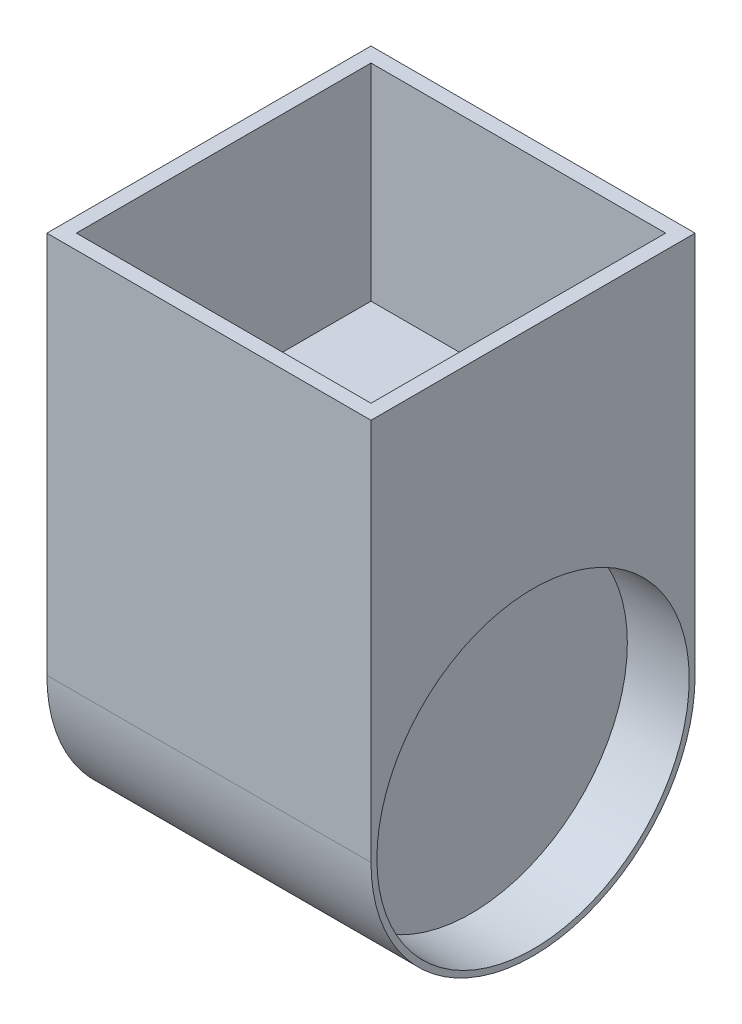
ISO-10303-21;
HEADER;
FILE_DESCRIPTION(('STEP AP214'),'2;1');
FILE_NAME('part.step','',(''),(''),'','','');
FILE_SCHEMA(('AUTOMOTIVE_DESIGN { 1 0 10303 214 1 1 1 1 }'));
ENDSEC;
DATA;
#1=APPLICATION_CONTEXT('core data for automotive mechanical design processes');
#2=APPLICATION_PROTOCOL_DEFINITION('international standard','automotive_design',2000,#1);
#3=PRODUCT_CONTEXT('',#1,'mechanical');
#4=PRODUCT('Part','Part','',(#3));
#5=PRODUCT_RELATED_PRODUCT_CATEGORY('part','',(#4));
#6=PRODUCT_DEFINITION_FORMATION('','',#4);
#7=PRODUCT_DEFINITION_CONTEXT('part definition',#1,'design');
#8=PRODUCT_DEFINITION('design','',#6,#7);
#9=PRODUCT_DEFINITION_SHAPE('','',#8);
#10=(LENGTH_UNIT() NAMED_UNIT(*) SI_UNIT(.MILLI.,.METRE.));
#11=(NAMED_UNIT(*) PLANE_ANGLE_UNIT() SI_UNIT($,.RADIAN.));
#12=(NAMED_UNIT(*) SI_UNIT($,.STERADIAN.) SOLID_ANGLE_UNIT());
#13=UNCERTAINTY_MEASURE_WITH_UNIT(LENGTH_MEASURE(1.E-05),#10,'distance_accuracy_value','');
#14=(GEOMETRIC_REPRESENTATION_CONTEXT(3) GLOBAL_UNCERTAINTY_ASSIGNED_CONTEXT((#13)) GLOBAL_UNIT_ASSIGNED_CONTEXT((#10,
#11,#12)) REPRESENTATION_CONTEXT('',''));
#15=CARTESIAN_POINT('',(0.,0.,0.));
#16=DIRECTION('',(0.,0.,1.));
#17=DIRECTION('',(1.,0.,0.));
#18=AXIS2_PLACEMENT_3D('',#15,#16,#17);
#19=CARTESIAN_POINT('',(110.,129.977668721997,55.));
#20=DIRECTION('',(0.,1.,0.));
#21=DIRECTION('',(0.,0.,1.));
#22=AXIS2_PLACEMENT_3D('',#19,#20,#21);
#23=PLANE('',#22);
#24=DIRECTION('',(0.,0.,1.));
#25=VECTOR('',#24,1.);
#26=CARTESIAN_POINT('',(4.99999999999999,129.977668721997,50.));
#27=LINE('',#26,#25);
#28=CARTESIAN_POINT('',(4.99999999999999,129.977668721997,-50.));
#29=VERTEX_POINT('',#28);
#30=CARTESIAN_POINT('',(4.99999999999999,129.977668721997,50.));
#31=VERTEX_POINT('',#30);
#32=EDGE_CURVE('E53',#29,#31,#27,.T.);
#33=ORIENTED_EDGE('',*,*,#32,.F.);
#34=DIRECTION('',(-1.,0.,0.));
#35=VECTOR('',#34,1.);
#36=CARTESIAN_POINT('',(4.99999999999999,129.977668721997,-50.));
#37=LINE('',#36,#35);
#38=CARTESIAN_POINT('',(105.,129.977668721997,-50.));
#39=VERTEX_POINT('',#38);
#40=EDGE_CURVE('E129',#39,#29,#37,.T.);
#41=ORIENTED_EDGE('',*,*,#40,.F.);
#42=DIRECTION('',(0.,0.,-1.));
#43=VECTOR('',#42,1.);
#44=CARTESIAN_POINT('',(105.,129.977668721997,-50.));
#45=LINE('',#44,#43);
#46=CARTESIAN_POINT('',(105.,129.977668721997,50.));
#47=VERTEX_POINT('',#46);
#48=EDGE_CURVE('E132',#47,#39,#45,.T.);
#49=ORIENTED_EDGE('',*,*,#48,.F.);
#50=DIRECTION('',(1.,0.,0.));
#51=VECTOR('',#50,1.);
#52=CARTESIAN_POINT('',(105.,129.977668721997,50.));
#53=LINE('',#52,#51);
#54=EDGE_CURVE('E141',#31,#47,#53,.T.);
#55=ORIENTED_EDGE('',*,*,#54,.F.);
#56=EDGE_LOOP('',(#33,#41,#49,#55));
#57=FACE_BOUND('',#56,.T.);
#58=DIRECTION('',(0.,0.,-1.));
#59=VECTOR('',#58,1.);
#60=CARTESIAN_POINT('',(0.,129.977668721997,55.));
#61=LINE('',#60,#59);
#62=CARTESIAN_POINT('',(0.,129.977668721997,55.));
#63=VERTEX_POINT('',#62);
#64=CARTESIAN_POINT('',(0.,129.977668721997,-55.));
#65=VERTEX_POINT('',#64);
#66=EDGE_CURVE('E148',#63,#65,#61,.T.);
#67=ORIENTED_EDGE('',*,*,#66,.F.);
#68=DIRECTION('',(-1.,0.,0.));
#69=VECTOR('',#68,1.);
#70=CARTESIAN_POINT('',(110.,129.977668721997,55.));
#71=LINE('',#70,#69);
#72=CARTESIAN_POINT('',(110.,129.977668721997,55.));
#73=VERTEX_POINT('',#72);
#74=EDGE_CURVE('E11',#73,#63,#71,.T.);
#75=ORIENTED_EDGE('',*,*,#74,.F.);
#76=DIRECTION('',(0.,0.,-1.));
#77=VECTOR('',#76,1.);
#78=CARTESIAN_POINT('',(110.,129.977668721997,55.));
#79=LINE('',#78,#77);
#80=CARTESIAN_POINT('',(110.,129.977668721997,-55.));
#81=VERTEX_POINT('',#80);
#82=EDGE_CURVE('E152',#73,#81,#79,.T.);
#83=ORIENTED_EDGE('',*,*,#82,.T.);
#84=DIRECTION('',(-1.,0.,0.));
#85=VECTOR('',#84,1.);
#86=CARTESIAN_POINT('',(110.,129.977668721997,-55.));
#87=LINE('',#86,#85);
#88=EDGE_CURVE('E40',#81,#65,#87,.T.);
#89=ORIENTED_EDGE('',*,*,#88,.T.);
#90=EDGE_LOOP('',(#67,#75,#83,#89));
#91=FACE_BOUND('',#90,.T.);
#92=ADVANCED_FACE('F37',(#57,#91),#23,.T.);
#93=CARTESIAN_POINT('',(110.,5.62220776878508E-06,55.));
#94=DIRECTION('',(0.,0.,1.));
#95=DIRECTION('',(1.,0.,0.));
#96=AXIS2_PLACEMENT_3D('',#93,#94,#95);
#97=PLANE('',#96);
#98=DIRECTION('',(0.,1.,0.));
#99=VECTOR('',#98,1.);
#100=CARTESIAN_POINT('',(0.,5.62220776878508E-06,55.));
#101=LINE('',#100,#99);
#102=CARTESIAN_POINT('',(0.,5.62220778821399E-06,54.9999999999999));
#103=VERTEX_POINT('',#102);
#104=EDGE_CURVE('E155',#103,#63,#101,.T.);
#105=ORIENTED_EDGE('',*,*,#104,.F.);
#106=DIRECTION('',(-1.,0.,0.));
#107=VECTOR('',#106,1.);
#108=CARTESIAN_POINT('',(110.,5.62220778821399E-06,54.9999999999999));
#109=LINE('',#108,#107);
#110=CARTESIAN_POINT('',(110.,5.62220778821399E-06,54.9999999999999));
#111=VERTEX_POINT('',#110);
#112=EDGE_CURVE('E45',#111,#103,#109,.T.);
#113=ORIENTED_EDGE('',*,*,#112,.F.);
#114=DIRECTION('',(0.,1.,0.));
#115=VECTOR('',#114,1.);
#116=CARTESIAN_POINT('',(110.,5.62220776878508E-06,55.));
#117=LINE('',#116,#115);
#118=EDGE_CURVE('E160',#111,#73,#117,.T.);
#119=ORIENTED_EDGE('',*,*,#118,.T.);
#120=ORIENTED_EDGE('',*,*,#74,.T.);
#121=EDGE_LOOP('',(#105,#113,#119,#120));
#122=FACE_BOUND('',#121,.T.);
#123=ADVANCED_FACE('F177',(#122),#97,.T.);
#124=CARTESIAN_POINT('',(110.,0.,0.));
#125=DIRECTION('',(-1.,0.,0.));
#126=DIRECTION('',(0.,0.,1.));
#127=AXIS2_PLACEMENT_3D('',#124,#125,#126);
#128=CYLINDRICAL_SURFACE('',#127,55.0000000000001);
#129=CARTESIAN_POINT('',(0.,0.,0.));
#130=DIRECTION('',(-1.,0.,0.));
#131=DIRECTION('',(0.,0.,1.));
#132=AXIS2_PLACEMENT_3D('',#129,#130,#131);
#133=CIRCLE('',#132,55.0000000000001);
#134=CARTESIAN_POINT('',(0.,-2.7473816971435E-07,-55.));
#135=VERTEX_POINT('',#134);
#136=EDGE_CURVE('E167',#135,#103,#133,.T.);
#137=ORIENTED_EDGE('',*,*,#136,.F.);
#138=DIRECTION('',(-1.,0.,0.));
#139=VECTOR('',#138,1.);
#140=CARTESIAN_POINT('',(110.,-2.7473816971435E-07,-55.));
#141=LINE('',#140,#139);
#142=CARTESIAN_POINT('',(110.,-2.7473816971435E-07,-55.));
#143=VERTEX_POINT('',#142);
#144=EDGE_CURVE('E172',#143,#135,#141,.T.);
#145=ORIENTED_EDGE('',*,*,#144,.F.);
#146=CARTESIAN_POINT('',(110.,0.,0.));
#147=DIRECTION('',(-1.,0.,0.));
#148=DIRECTION('',(0.,0.,1.));
#149=AXIS2_PLACEMENT_3D('',#146,#147,#148);
#150=CIRCLE('',#149,55.0000000000001);
#151=EDGE_CURVE('E157',#143,#111,#150,.T.);
#152=ORIENTED_EDGE('',*,*,#151,.T.);
#153=ORIENTED_EDGE('',*,*,#112,.T.);
#154=EDGE_LOOP('',(#137,#145,#152,#153));
#155=FACE_BOUND('',#154,.T.);
#156=ADVANCED_FACE('F181',(#155),#128,.T.);
#157=CARTESIAN_POINT('',(110.,129.977668721997,-55.));
#158=DIRECTION('',(0.,0.,-1.));
#159=DIRECTION('',(0.,1.,0.));
#160=AXIS2_PLACEMENT_3D('',#157,#158,#159);
#161=PLANE('',#160);
#162=DIRECTION('',(0.,-1.,0.));
#163=VECTOR('',#162,1.);
#164=CARTESIAN_POINT('',(0.,129.977668721997,-55.));
#165=LINE('',#164,#163);
#166=EDGE_CURVE('E164',#65,#135,#165,.T.);
#167=ORIENTED_EDGE('',*,*,#166,.F.);
#168=ORIENTED_EDGE('',*,*,#88,.F.);
#169=DIRECTION('',(0.,-1.,0.));
#170=VECTOR('',#169,1.);
#171=CARTESIAN_POINT('',(110.,129.977668721997,-55.));
#172=LINE('',#171,#170);
#173=EDGE_CURVE('E154',#81,#143,#172,.T.);
#174=ORIENTED_EDGE('',*,*,#173,.T.);
#175=ORIENTED_EDGE('',*,*,#144,.T.);
#176=EDGE_LOOP('',(#167,#168,#174,#175));
#177=FACE_BOUND('',#176,.T.);
#178=ADVANCED_FACE('F174',(#177),#161,.T.);
#179=CARTESIAN_POINT('',(110.,0.,0.));
#180=DIRECTION('',(-1.,0.,0.));
#181=DIRECTION('',(0.,0.,1.));
#182=AXIS2_PLACEMENT_3D('',#179,#180,#181);
#183=PLANE('',#182);
#184=CARTESIAN_POINT('',(110.,0.,0.));
#185=DIRECTION('',(1.,0.,0.));
#186=DIRECTION('',(0.,0.,-1.));
#187=AXIS2_PLACEMENT_3D('',#184,#185,#186);
#188=CIRCLE('',#187,53.);
#189=CARTESIAN_POINT('',(110.,0.,-53.));
#190=VERTEX_POINT('',#189);
#191=EDGE_CURVE('E135',#190,#190,#188,.T.);
#192=ORIENTED_EDGE('',*,*,#191,.F.);
#193=EDGE_LOOP('',(#192));
#194=FACE_BOUND('',#193,.T.);
#195=ORIENTED_EDGE('',*,*,#82,.F.);
#196=ORIENTED_EDGE('',*,*,#118,.F.);
#197=ORIENTED_EDGE('',*,*,#151,.F.);
#198=ORIENTED_EDGE('',*,*,#173,.F.);
#199=EDGE_LOOP('',(#195,#196,#197,#198));
#200=FACE_BOUND('',#199,.T.);
#201=ADVANCED_FACE('F183',(#194,#200),#183,.F.);
#202=CARTESIAN_POINT('',(0.,0.,0.));
#203=DIRECTION('',(-1.,0.,0.));
#204=DIRECTION('',(0.,0.,1.));
#205=AXIS2_PLACEMENT_3D('',#202,#203,#204);
#206=PLANE('',#205);
#207=ORIENTED_EDGE('',*,*,#66,.T.);
#208=ORIENTED_EDGE('',*,*,#166,.T.);
#209=ORIENTED_EDGE('',*,*,#136,.T.);
#210=ORIENTED_EDGE('',*,*,#104,.T.);
#211=EDGE_LOOP('',(#207,#208,#209,#210));
#212=FACE_BOUND('',#211,.T.);
#213=ADVANCED_FACE('F176',(#212),#206,.T.);
#214=CARTESIAN_POINT('',(4.99999999999999,59.9776687219972,50.));
#215=DIRECTION('',(-1.,0.,0.));
#216=DIRECTION('',(0.,0.,1.));
#217=AXIS2_PLACEMENT_3D('',#214,#215,#216);
#218=PLANE('',#217);
#219=ORIENTED_EDGE('',*,*,#32,.T.);
#220=DIRECTION('',(0.,1.,0.));
#221=VECTOR('',#220,1.);
#222=CARTESIAN_POINT('',(4.99999999999999,59.9776687219972,50.));
#223=LINE('',#222,#221);
#224=CARTESIAN_POINT('',(4.99999999999999,59.9776687219972,50.));
#225=VERTEX_POINT('',#224);
#226=EDGE_CURVE('E107',#225,#31,#223,.T.);
#227=ORIENTED_EDGE('',*,*,#226,.F.);
#228=DIRECTION('',(0.,0.,1.));
#229=VECTOR('',#228,1.);
#230=CARTESIAN_POINT('',(4.99999999999999,59.9776687219972,50.));
#231=LINE('',#230,#229);
#232=CARTESIAN_POINT('',(4.99999999999999,59.9776687219972,-50.));
#233=VERTEX_POINT('',#232);
#234=EDGE_CURVE('E111',#233,#225,#231,.T.);
#235=ORIENTED_EDGE('',*,*,#234,.F.);
#236=DIRECTION('',(0.,1.,0.));
#237=VECTOR('',#236,1.);
#238=CARTESIAN_POINT('',(4.99999999999999,59.9776687219972,-50.));
#239=LINE('',#238,#237);
#240=EDGE_CURVE('E146',#233,#29,#239,.T.);
#241=ORIENTED_EDGE('',*,*,#240,.T.);
#242=EDGE_LOOP('',(#219,#227,#235,#241));
#243=FACE_BOUND('',#242,.T.);
#244=ADVANCED_FACE('F109',(#243),#218,.F.);
#245=CARTESIAN_POINT('',(4.99999999999999,59.9776687219972,-50.));
#246=DIRECTION('',(0.,0.,-1.));
#247=DIRECTION('',(-1.,0.,0.));
#248=AXIS2_PLACEMENT_3D('',#245,#246,#247);
#249=PLANE('',#248);
#250=ORIENTED_EDGE('',*,*,#40,.T.);
#251=ORIENTED_EDGE('',*,*,#240,.F.);
#252=DIRECTION('',(-1.,0.,0.));
#253=VECTOR('',#252,1.);
#254=CARTESIAN_POINT('',(4.99999999999999,59.9776687219972,-50.));
#255=LINE('',#254,#253);
#256=CARTESIAN_POINT('',(105.,59.9776687219972,-50.));
#257=VERTEX_POINT('',#256);
#258=EDGE_CURVE('E117',#257,#233,#255,.T.);
#259=ORIENTED_EDGE('',*,*,#258,.F.);
#260=DIRECTION('',(0.,1.,0.));
#261=VECTOR('',#260,1.);
#262=CARTESIAN_POINT('',(105.,59.9776687219972,-50.));
#263=LINE('',#262,#261);
#264=EDGE_CURVE('E149',#257,#39,#263,.T.);
#265=ORIENTED_EDGE('',*,*,#264,.T.);
#266=EDGE_LOOP('',(#250,#251,#259,#265));
#267=FACE_BOUND('',#266,.T.);
#268=ADVANCED_FACE('F205',(#267),#249,.F.);
#269=CARTESIAN_POINT('',(105.,59.9776687219972,-50.));
#270=DIRECTION('',(1.,0.,0.));
#271=DIRECTION('',(0.,0.,-1.));
#272=AXIS2_PLACEMENT_3D('',#269,#270,#271);
#273=PLANE('',#272);
#274=ORIENTED_EDGE('',*,*,#48,.T.);
#275=ORIENTED_EDGE('',*,*,#264,.F.);
#276=DIRECTION('',(0.,0.,-1.));
#277=VECTOR('',#276,1.);
#278=CARTESIAN_POINT('',(105.,59.9776687219972,-50.));
#279=LINE('',#278,#277);
#280=CARTESIAN_POINT('',(105.,59.9776687219972,50.));
#281=VERTEX_POINT('',#280);
#282=EDGE_CURVE('E125',#281,#257,#279,.T.);
#283=ORIENTED_EDGE('',*,*,#282,.F.);
#284=DIRECTION('',(0.,1.,0.));
#285=VECTOR('',#284,1.);
#286=CARTESIAN_POINT('',(105.,59.9776687219972,50.));
#287=LINE('',#286,#285);
#288=EDGE_CURVE('E116',#281,#47,#287,.T.);
#289=ORIENTED_EDGE('',*,*,#288,.T.);
#290=EDGE_LOOP('',(#274,#275,#283,#289));
#291=FACE_BOUND('',#290,.T.);
#292=ADVANCED_FACE('F203',(#291),#273,.F.);
#293=CARTESIAN_POINT('',(105.,59.9776687219972,50.));
#294=DIRECTION('',(0.,0.,1.));
#295=DIRECTION('',(1.,0.,0.));
#296=AXIS2_PLACEMENT_3D('',#293,#294,#295);
#297=PLANE('',#296);
#298=ORIENTED_EDGE('',*,*,#54,.T.);
#299=ORIENTED_EDGE('',*,*,#288,.F.);
#300=DIRECTION('',(1.,0.,0.));
#301=VECTOR('',#300,1.);
#302=CARTESIAN_POINT('',(105.,59.9776687219972,50.));
#303=LINE('',#302,#301);
#304=EDGE_CURVE('E120',#225,#281,#303,.T.);
#305=ORIENTED_EDGE('',*,*,#304,.F.);
#306=ORIENTED_EDGE('',*,*,#226,.T.);
#307=EDGE_LOOP('',(#298,#299,#305,#306));
#308=FACE_BOUND('',#307,.T.);
#309=ADVANCED_FACE('F121',(#308),#297,.F.);
#310=CARTESIAN_POINT('',(0.,59.9776687219972,0.));
#311=DIRECTION('',(0.,-1.,0.));
#312=DIRECTION('',(0.,0.,-1.));
#313=AXIS2_PLACEMENT_3D('',#310,#311,#312);
#314=PLANE('',#313);
#315=ORIENTED_EDGE('',*,*,#234,.T.);
#316=ORIENTED_EDGE('',*,*,#304,.T.);
#317=ORIENTED_EDGE('',*,*,#282,.T.);
#318=ORIENTED_EDGE('',*,*,#258,.T.);
#319=EDGE_LOOP('',(#315,#316,#317,#318));
#320=FACE_BOUND('',#319,.T.);
#321=ADVANCED_FACE('F127',(#320),#314,.F.);
#322=CARTESIAN_POINT('',(89.,0.,0.));
#323=DIRECTION('',(1.,0.,0.));
#324=DIRECTION('',(0.,0.,-1.));
#325=AXIS2_PLACEMENT_3D('',#322,#323,#324);
#326=CYLINDRICAL_SURFACE('',#325,53.);
#327=CARTESIAN_POINT('',(89.,0.,0.));
#328=DIRECTION('',(1.,0.,0.));
#329=DIRECTION('',(0.,0.,-1.));
#330=AXIS2_PLACEMENT_3D('',#327,#328,#329);
#331=CIRCLE('',#330,53.);
#332=CARTESIAN_POINT('',(89.,0.,-53.));
#333=VERTEX_POINT('',#332);
#334=EDGE_CURVE('E142',#333,#333,#331,.T.);
#335=CARTESIAN_POINT('',(89.,0.,-53.));
#336=CARTESIAN_POINT('',(89.21875,0.,-53.));
#337=CARTESIAN_POINT('',(89.4375,0.,-53.));
#338=CARTESIAN_POINT('',(89.875,0.,-53.));
#339=CARTESIAN_POINT('',(90.09375,0.,-53.));
#340=CARTESIAN_POINT('',(90.53125,0.,-53.));
#341=CARTESIAN_POINT('',(90.75,0.,-53.));
#342=CARTESIAN_POINT('',(91.1875,0.,-53.));
#343=CARTESIAN_POINT('',(91.40625,0.,-53.));
#344=CARTESIAN_POINT('',(91.84375,0.,-53.));
#345=CARTESIAN_POINT('',(92.0625,0.,-53.));
#346=CARTESIAN_POINT('',(92.5,0.,-53.));
#347=CARTESIAN_POINT('',(92.71875,0.,-53.));
#348=CARTESIAN_POINT('',(93.15625,0.,-53.));
#349=CARTESIAN_POINT('',(93.375,0.,-53.));
#350=CARTESIAN_POINT('',(93.8125,0.,-53.));
#351=CARTESIAN_POINT('',(94.03125,0.,-53.));
#352=CARTESIAN_POINT('',(94.46875,0.,-53.));
#353=CARTESIAN_POINT('',(94.6875,0.,-53.));
#354=CARTESIAN_POINT('',(95.125,0.,-53.));
#355=CARTESIAN_POINT('',(95.34375,0.,-53.));
#356=CARTESIAN_POINT('',(95.78125,0.,-53.));
#357=CARTESIAN_POINT('',(96.,0.,-53.));
#358=CARTESIAN_POINT('',(96.4375,0.,-53.));
#359=CARTESIAN_POINT('',(96.65625,0.,-53.));
#360=CARTESIAN_POINT('',(97.09375,0.,-53.));
#361=CARTESIAN_POINT('',(97.3125,0.,-53.));
#362=CARTESIAN_POINT('',(97.75,0.,-53.));
#363=CARTESIAN_POINT('',(97.96875,0.,-53.));
#364=CARTESIAN_POINT('',(98.40625,0.,-53.));
#365=CARTESIAN_POINT('',(98.625,0.,-53.));
#366=CARTESIAN_POINT('',(99.0625,0.,-53.));
#367=CARTESIAN_POINT('',(99.28125,0.,-53.));
#368=CARTESIAN_POINT('',(99.71875,0.,-53.));
#369=CARTESIAN_POINT('',(99.9375,0.,-53.));
#370=CARTESIAN_POINT('',(100.375,0.,-53.));
#371=CARTESIAN_POINT('',(100.59375,0.,-53.));
#372=CARTESIAN_POINT('',(101.03125,0.,-53.));
#373=CARTESIAN_POINT('',(101.25,0.,-53.));
#374=CARTESIAN_POINT('',(101.6875,0.,-53.));
#375=CARTESIAN_POINT('',(101.90625,0.,-53.));
#376=CARTESIAN_POINT('',(102.34375,0.,-53.));
#377=CARTESIAN_POINT('',(102.5625,0.,-53.));
#378=CARTESIAN_POINT('',(103.,0.,-53.));
#379=CARTESIAN_POINT('',(103.21875,0.,-53.));
#380=CARTESIAN_POINT('',(103.65625,0.,-53.));
#381=CARTESIAN_POINT('',(103.875,0.,-53.));
#382=CARTESIAN_POINT('',(104.3125,0.,-53.));
#383=CARTESIAN_POINT('',(104.53125,0.,-53.));
#384=CARTESIAN_POINT('',(104.96875,0.,-53.));
#385=CARTESIAN_POINT('',(105.1875,0.,-53.));
#386=CARTESIAN_POINT('',(105.625,0.,-53.));
#387=CARTESIAN_POINT('',(105.84375,0.,-53.));
#388=CARTESIAN_POINT('',(106.28125,0.,-53.));
#389=CARTESIAN_POINT('',(106.5,0.,-53.));
#390=CARTESIAN_POINT('',(106.9375,0.,-53.));
#391=CARTESIAN_POINT('',(107.15625,0.,-53.));
#392=CARTESIAN_POINT('',(107.59375,0.,-53.));
#393=CARTESIAN_POINT('',(107.8125,0.,-53.));
#394=CARTESIAN_POINT('',(108.25,0.,-53.));
#395=CARTESIAN_POINT('',(108.46875,0.,-53.));
#396=CARTESIAN_POINT('',(108.90625,0.,-53.));
#397=CARTESIAN_POINT('',(109.125,0.,-53.));
#398=CARTESIAN_POINT('',(109.5625,0.,-53.));
#399=CARTESIAN_POINT('',(109.78125,0.,-53.));
#400=CARTESIAN_POINT('',(110.,0.,-53.));
#401=B_SPLINE_CURVE_WITH_KNOTS('',3,(#335,#336,#337,#338,#339,#340,#341,#342,#343,#344,#345,
#346,#347,#348,#349,#350,#351,#352,#353,#354,#355,#356,#357,#358,#359,#360,#361,#362,#363,#364,
#365,#366,#367,#368,#369,#370,#371,#372,#373,#374,#375,#376,#377,#378,#379,#380,#381,#382,#383,
#384,#385,#386,#387,#388,#389,#390,#391,#392,#393,#394,#395,#396,#397,#398,#399,#400),
.UNSPECIFIED.,.F.,.F.,(4,2,2,2,2,2,2,2,2,2,2,2,2,2,2,2,2,2,2,2,2,2,2,2,2,2,2,2,2,2,2,2,4),(0.,
0.656250000000011,1.31250000000001,1.96875000000001,2.625,3.28125000000001,3.93750000000001,
4.59375000000001,5.25,5.90625000000002,6.56250000000001,7.21875000000001,7.87500000000001,
8.53125,9.18750000000001,9.84375000000001,10.5,11.15625,11.8125,12.46875,13.125,13.78125,
14.4375,15.09375,15.75,16.40625,17.0625,17.71875,18.375,19.03125,19.6875,20.34375,21.),.UNSPECIFIED.);
#402=EDGE_CURVE('BSEAM220',#333,#190,#401,.T.);
#403=ORIENTED_EDGE('',*,*,#334,.F.);
#404=ORIENTED_EDGE('',*,*,#191,.T.);
#405=ORIENTED_EDGE('',*,*,#402,.T.);
#406=ORIENTED_EDGE('',*,*,#402,.F.);
#407=EDGE_LOOP('',(#403,#405,#404,#406));
#408=FACE_BOUND('',#407,.T.);
#409=ADVANCED_FACE('F220',(#408),#326,.F.);
#410=CARTESIAN_POINT('',(89.,0.,0.));
#411=DIRECTION('',(1.,0.,0.));
#412=DIRECTION('',(0.,0.,-1.));
#413=AXIS2_PLACEMENT_3D('',#410,#411,#412);
#414=PLANE('',#413);
#415=ORIENTED_EDGE('',*,*,#334,.T.);
#416=EDGE_LOOP('',(#415));
#417=FACE_BOUND('',#416,.T.);
#418=ADVANCED_FACE('F224',(#417),#414,.T.);
#419=CLOSED_SHELL('',(#92,#123,#156,#178,#201,#213,#244,#268,#292,#309,#321,#409,#418));
#420=MANIFOLD_SOLID_BREP('B2',#419);
#421=ADVANCED_BREP_SHAPE_REPRESENTATION('',(#18,#420),#14);
#422=SHAPE_DEFINITION_REPRESENTATION(#9,#421);
ENDSEC;
END-ISO-10303-21;
